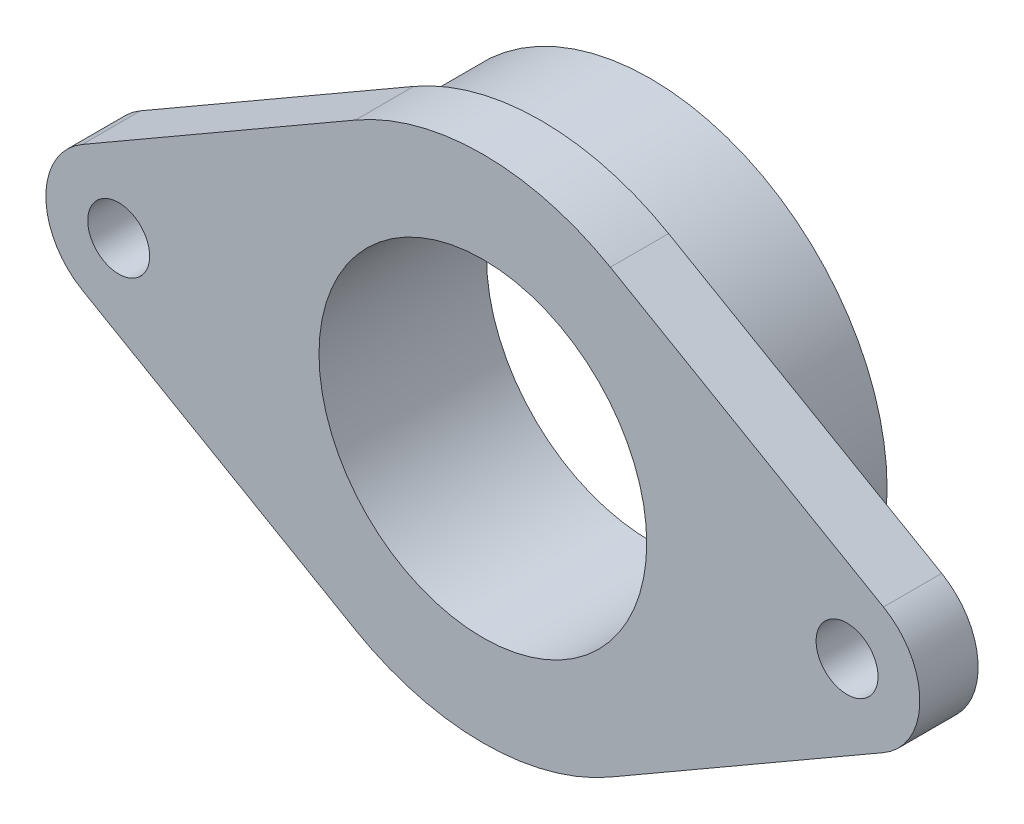
ISO-10303-21;
HEADER;
FILE_DESCRIPTION(('STEP AP214'),'2;1');
FILE_NAME('part.step','',(''),(''),'','','');
FILE_SCHEMA(('AUTOMOTIVE_DESIGN { 1 0 10303 214 1 1 1 1 }'));
ENDSEC;
DATA;
#1=APPLICATION_CONTEXT('core data for automotive mechanical design processes');
#2=APPLICATION_PROTOCOL_DEFINITION('international standard','automotive_design',2000,#1);
#3=PRODUCT_CONTEXT('',#1,'mechanical');
#4=PRODUCT('Part','Part','',(#3));
#5=PRODUCT_RELATED_PRODUCT_CATEGORY('part','',(#4));
#6=PRODUCT_DEFINITION_FORMATION('','',#4);
#7=PRODUCT_DEFINITION_CONTEXT('part definition',#1,'design');
#8=PRODUCT_DEFINITION('design','',#6,#7);
#9=PRODUCT_DEFINITION_SHAPE('','',#8);
#10=(LENGTH_UNIT() NAMED_UNIT(*) SI_UNIT(.MILLI.,.METRE.));
#11=(NAMED_UNIT(*) PLANE_ANGLE_UNIT() SI_UNIT($,.RADIAN.));
#12=(NAMED_UNIT(*) SI_UNIT($,.STERADIAN.) SOLID_ANGLE_UNIT());
#13=UNCERTAINTY_MEASURE_WITH_UNIT(LENGTH_MEASURE(1.E-05),#10,'distance_accuracy_value','');
#14=(GEOMETRIC_REPRESENTATION_CONTEXT(3) GLOBAL_UNCERTAINTY_ASSIGNED_CONTEXT((#13)) GLOBAL_UNIT_ASSIGNED_CONTEXT((#10,
#11,#12)) REPRESENTATION_CONTEXT('',''));
#15=CARTESIAN_POINT('',(0.,0.,0.));
#16=DIRECTION('',(0.,0.,1.));
#17=DIRECTION('',(1.,0.,0.));
#18=AXIS2_PLACEMENT_3D('',#15,#16,#17);
#19=CARTESIAN_POINT('',(-50.,0.,0.));
#20=DIRECTION('',(0.,0.,1.));
#21=DIRECTION('',(1.,0.,0.));
#22=AXIS2_PLACEMENT_3D('',#19,#20,#21);
#23=PLANE('',#22);
#24=CARTESIAN_POINT('',(-50.,0.,0.));
#25=DIRECTION('',(0.,0.,1.));
#26=DIRECTION('',(1.,0.,0.));
#27=AXIS2_PLACEMENT_3D('',#24,#25,#26);
#28=CIRCLE('',#27,4.25000000000001);
#29=CARTESIAN_POINT('',(-45.75,0.,0.));
#30=VERTEX_POINT('',#29);
#31=EDGE_CURVE('E227',#30,#30,#28,.T.);
#32=ORIENTED_EDGE('',*,*,#31,.T.);
#33=EDGE_LOOP('',(#32));
#34=FACE_BOUND('',#33,.T.);
#35=CARTESIAN_POINT('',(50.,0.,0.));
#36=DIRECTION('',(0.,0.,1.));
#37=DIRECTION('',(1.,0.,0.));
#38=AXIS2_PLACEMENT_3D('',#35,#36,#37);
#39=CIRCLE('',#38,4.25000000000001);
#40=CARTESIAN_POINT('',(54.25,0.,0.));
#41=VERTEX_POINT('',#40);
#42=EDGE_CURVE('E219',#41,#41,#39,.T.);
#43=ORIENTED_EDGE('',*,*,#42,.T.);
#44=EDGE_LOOP('',(#43));
#45=FACE_BOUND('',#44,.T.);
#46=CARTESIAN_POINT('',(-50.,0.,0.));
#47=DIRECTION('',(0.,0.,1.));
#48=DIRECTION('',(1.,0.,0.));
#49=AXIS2_PLACEMENT_3D('',#46,#47,#48);
#50=CIRCLE('',#49,10.);
#51=CARTESIAN_POINT('',(-55.,8.66025403784439,0.));
#52=VERTEX_POINT('',#51);
#53=CARTESIAN_POINT('',(-55.,-8.66025403784439,0.));
#54=VERTEX_POINT('',#53);
#55=EDGE_CURVE('E143',#52,#54,#50,.T.);
#56=ORIENTED_EDGE('',*,*,#55,.F.);
#57=DIRECTION('',(-0.866025403784438,-0.5,0.));
#58=VECTOR('',#57,1.);
#59=CARTESIAN_POINT('',(-55.,8.66025403784439,0.));
#60=LINE('',#59,#58);
#61=CARTESIAN_POINT('',(-17.5,30.3108891324554,0.));
#62=VERTEX_POINT('',#61);
#63=EDGE_CURVE('E92',#62,#52,#60,.T.);
#64=ORIENTED_EDGE('',*,*,#63,.F.);
#65=CARTESIAN_POINT('',(0.,0.,0.));
#66=DIRECTION('',(0.,0.,1.));
#67=DIRECTION('',(1.,0.,0.));
#68=AXIS2_PLACEMENT_3D('',#65,#66,#67);
#69=CIRCLE('',#68,35.);
#70=CARTESIAN_POINT('',(17.5,30.3108891324554,0.));
#71=VERTEX_POINT('',#70);
#72=EDGE_CURVE('E86',#71,#62,#69,.T.);
#73=ORIENTED_EDGE('',*,*,#72,.F.);
#74=DIRECTION('',(-0.866025403784438,0.5,0.));
#75=VECTOR('',#74,1.);
#76=CARTESIAN_POINT('',(55.,8.66025403784439,0.));
#77=LINE('',#76,#75);
#78=CARTESIAN_POINT('',(55.,8.66025403784439,0.));
#79=VERTEX_POINT('',#78);
#80=EDGE_CURVE('E130',#79,#71,#77,.T.);
#81=ORIENTED_EDGE('',*,*,#80,.F.);
#82=CARTESIAN_POINT('',(50.,0.,0.));
#83=DIRECTION('',(0.,0.,1.));
#84=DIRECTION('',(1.,0.,0.));
#85=AXIS2_PLACEMENT_3D('',#82,#83,#84);
#86=CIRCLE('',#85,10.);
#87=CARTESIAN_POINT('',(55.,-8.66025403784439,0.));
#88=VERTEX_POINT('',#87);
#89=EDGE_CURVE('E157',#88,#79,#86,.T.);
#90=ORIENTED_EDGE('',*,*,#89,.F.);
#91=DIRECTION('',(0.866025403784438,0.5,0.));
#92=VECTOR('',#91,1.);
#93=CARTESIAN_POINT('',(55.,-8.66025403784439,0.));
#94=LINE('',#93,#92);
#95=CARTESIAN_POINT('',(17.5,-30.3108891324554,0.));
#96=VERTEX_POINT('',#95);
#97=EDGE_CURVE('E154',#96,#88,#94,.T.);
#98=ORIENTED_EDGE('',*,*,#97,.F.);
#99=CARTESIAN_POINT('',(0.,0.,0.));
#100=DIRECTION('',(0.,0.,1.));
#101=DIRECTION('',(1.,0.,0.));
#102=AXIS2_PLACEMENT_3D('',#99,#100,#101);
#103=CIRCLE('',#102,35.);
#104=CARTESIAN_POINT('',(-17.5,-30.3108891324554,0.));
#105=VERTEX_POINT('',#104);
#106=EDGE_CURVE('E151',#105,#96,#103,.T.);
#107=ORIENTED_EDGE('',*,*,#106,.F.);
#108=DIRECTION('',(0.866025403784438,-0.5,0.));
#109=VECTOR('',#108,1.);
#110=CARTESIAN_POINT('',(-55.,-8.66025403784439,0.));
#111=LINE('',#110,#109);
#112=EDGE_CURVE('E147',#54,#105,#111,.T.);
#113=ORIENTED_EDGE('',*,*,#112,.F.);
#114=EDGE_LOOP('',(#56,#64,#73,#81,#90,#98,#107,#113));
#115=FACE_BOUND('',#114,.T.);
#116=CARTESIAN_POINT('',(0.,0.,0.));
#117=DIRECTION('',(0.,0.,1.));
#118=DIRECTION('',(1.,0.,0.));
#119=AXIS2_PLACEMENT_3D('',#116,#117,#118);
#120=CIRCLE('',#119,32.5);
#121=CARTESIAN_POINT('',(32.5,0.,0.));
#122=VERTEX_POINT('',#121);
#123=EDGE_CURVE('E11',#122,#122,#120,.F.);
#124=ORIENTED_EDGE('',*,*,#123,.F.);
#125=EDGE_LOOP('',(#124));
#126=FACE_BOUND('',#125,.T.);
#127=ADVANCED_FACE('F39',(#34,#45,#115,#126),#23,.F.);
#128=CARTESIAN_POINT('',(-50.,0.,8.));
#129=DIRECTION('',(0.,0.,1.));
#130=DIRECTION('',(1.,0.,0.));
#131=AXIS2_PLACEMENT_3D('',#128,#129,#130);
#132=PLANE('',#131);
#133=CARTESIAN_POINT('',(50.,0.,8.));
#134=DIRECTION('',(0.,0.,1.));
#135=DIRECTION('',(1.,0.,0.));
#136=AXIS2_PLACEMENT_3D('',#133,#134,#135);
#137=CIRCLE('',#136,4.25000000000001);
#138=CARTESIAN_POINT('',(54.25,0.,8.));
#139=VERTEX_POINT('',#138);
#140=EDGE_CURVE('E218',#139,#139,#137,.T.);
#141=ORIENTED_EDGE('',*,*,#140,.F.);
#142=EDGE_LOOP('',(#141));
#143=FACE_BOUND('',#142,.T.);
#144=CARTESIAN_POINT('',(-50.,0.,8.));
#145=DIRECTION('',(0.,0.,1.));
#146=DIRECTION('',(1.,0.,0.));
#147=AXIS2_PLACEMENT_3D('',#144,#145,#146);
#148=CIRCLE('',#147,10.);
#149=CARTESIAN_POINT('',(-55.,8.66025403784439,8.));
#150=VERTEX_POINT('',#149);
#151=CARTESIAN_POINT('',(-55.,-8.66025403784439,8.));
#152=VERTEX_POINT('',#151);
#153=EDGE_CURVE('E166',#150,#152,#148,.T.);
#154=ORIENTED_EDGE('',*,*,#153,.T.);
#155=DIRECTION('',(0.866025403784438,-0.5,0.));
#156=VECTOR('',#155,1.);
#157=CARTESIAN_POINT('',(-55.,-8.66025403784439,8.));
#158=LINE('',#157,#156);
#159=CARTESIAN_POINT('',(-17.5,-30.3108891324554,8.));
#160=VERTEX_POINT('',#159);
#161=EDGE_CURVE('E101',#152,#160,#158,.T.);
#162=ORIENTED_EDGE('',*,*,#161,.T.);
#163=CARTESIAN_POINT('',(0.,0.,8.));
#164=DIRECTION('',(0.,0.,1.));
#165=DIRECTION('',(1.,0.,0.));
#166=AXIS2_PLACEMENT_3D('',#163,#164,#165);
#167=CIRCLE('',#166,35.);
#168=CARTESIAN_POINT('',(17.5,-30.3108891324554,8.));
#169=VERTEX_POINT('',#168);
#170=EDGE_CURVE('E205',#160,#169,#167,.T.);
#171=ORIENTED_EDGE('',*,*,#170,.T.);
#172=DIRECTION('',(0.866025403784438,0.5,0.));
#173=VECTOR('',#172,1.);
#174=CARTESIAN_POINT('',(55.,-8.66025403784439,8.));
#175=LINE('',#174,#173);
#176=CARTESIAN_POINT('',(55.,-8.66025403784439,8.));
#177=VERTEX_POINT('',#176);
#178=EDGE_CURVE('E203',#169,#177,#175,.T.);
#179=ORIENTED_EDGE('',*,*,#178,.T.);
#180=CARTESIAN_POINT('',(50.,0.,8.));
#181=DIRECTION('',(0.,0.,1.));
#182=DIRECTION('',(1.,0.,0.));
#183=AXIS2_PLACEMENT_3D('',#180,#181,#182);
#184=CIRCLE('',#183,10.);
#185=CARTESIAN_POINT('',(55.,8.66025403784439,8.));
#186=VERTEX_POINT('',#185);
#187=EDGE_CURVE('E121',#177,#186,#184,.T.);
#188=ORIENTED_EDGE('',*,*,#187,.T.);
#189=DIRECTION('',(-0.866025403784438,0.5,0.));
#190=VECTOR('',#189,1.);
#191=CARTESIAN_POINT('',(55.,8.66025403784439,8.));
#192=LINE('',#191,#190);
#193=CARTESIAN_POINT('',(17.5,30.3108891324554,8.));
#194=VERTEX_POINT('',#193);
#195=EDGE_CURVE('E114',#186,#194,#192,.T.);
#196=ORIENTED_EDGE('',*,*,#195,.T.);
#197=CARTESIAN_POINT('',(0.,0.,8.));
#198=DIRECTION('',(0.,0.,1.));
#199=DIRECTION('',(1.,0.,0.));
#200=AXIS2_PLACEMENT_3D('',#197,#198,#199);
#201=CIRCLE('',#200,35.);
#202=CARTESIAN_POINT('',(-17.5,30.3108891324554,8.));
#203=VERTEX_POINT('',#202);
#204=EDGE_CURVE('E119',#194,#203,#201,.T.);
#205=ORIENTED_EDGE('',*,*,#204,.T.);
#206=DIRECTION('',(-0.866025403784438,-0.5,0.));
#207=VECTOR('',#206,1.);
#208=CARTESIAN_POINT('',(-55.,8.66025403784439,8.));
#209=LINE('',#208,#207);
#210=EDGE_CURVE('E57',#203,#150,#209,.T.);
#211=ORIENTED_EDGE('',*,*,#210,.T.);
#212=EDGE_LOOP('',(#154,#162,#171,#179,#188,#196,#205,#211));
#213=FACE_BOUND('',#212,.T.);
#214=CARTESIAN_POINT('',(0.,0.,8.));
#215=DIRECTION('',(0.,0.,1.));
#216=DIRECTION('',(1.,0.,0.));
#217=AXIS2_PLACEMENT_3D('',#214,#215,#216);
#218=CIRCLE('',#217,22.5);
#219=CARTESIAN_POINT('',(22.5,0.,8.));
#220=VERTEX_POINT('',#219);
#221=EDGE_CURVE('E148',#220,#220,#218,.T.);
#222=ORIENTED_EDGE('',*,*,#221,.F.);
#223=EDGE_LOOP('',(#222));
#224=FACE_BOUND('',#223,.T.);
#225=CARTESIAN_POINT('',(-50.,0.,8.));
#226=DIRECTION('',(0.,0.,1.));
#227=DIRECTION('',(1.,0.,0.));
#228=AXIS2_PLACEMENT_3D('',#225,#226,#227);
#229=CIRCLE('',#228,4.25000000000001);
#230=CARTESIAN_POINT('',(-45.75,0.,8.));
#231=VERTEX_POINT('',#230);
#232=EDGE_CURVE('E223',#231,#231,#229,.T.);
#233=ORIENTED_EDGE('',*,*,#232,.F.);
#234=EDGE_LOOP('',(#233));
#235=FACE_BOUND('',#234,.T.);
#236=ADVANCED_FACE('F116',(#143,#213,#224,#235),#132,.T.);
#237=CARTESIAN_POINT('',(-50.,0.,8.));
#238=DIRECTION('',(0.,0.,-1.));
#239=DIRECTION('',(-1.,0.,0.));
#240=AXIS2_PLACEMENT_3D('',#237,#238,#239);
#241=CYLINDRICAL_SURFACE('',#240,10.);
#242=ORIENTED_EDGE('',*,*,#55,.T.);
#243=DIRECTION('',(0.,0.,-1.));
#244=VECTOR('',#243,1.);
#245=CARTESIAN_POINT('',(-55.,-8.66025403784439,8.));
#246=LINE('',#245,#244);
#247=EDGE_CURVE('E49',#152,#54,#246,.T.);
#248=ORIENTED_EDGE('',*,*,#247,.F.);
#249=ORIENTED_EDGE('',*,*,#153,.F.);
#250=DIRECTION('',(0.,0.,-1.));
#251=VECTOR('',#250,1.);
#252=CARTESIAN_POINT('',(-55.,8.66025403784439,8.));
#253=LINE('',#252,#251);
#254=EDGE_CURVE('E139',#150,#52,#253,.T.);
#255=ORIENTED_EDGE('',*,*,#254,.T.);
#256=EDGE_LOOP('',(#242,#248,#249,#255));
#257=FACE_BOUND('',#256,.T.);
#258=ADVANCED_FACE('F41',(#257),#241,.T.);
#259=CARTESIAN_POINT('',(-55.,-8.66025403784439,8.));
#260=DIRECTION('',(0.5,0.866025403784439,0.));
#261=DIRECTION('',(-0.866025403784438,0.5,0.));
#262=AXIS2_PLACEMENT_3D('',#259,#260,#261);
#263=PLANE('',#262);
#264=ORIENTED_EDGE('',*,*,#112,.T.);
#265=DIRECTION('',(0.,0.,-1.));
#266=VECTOR('',#265,1.);
#267=CARTESIAN_POINT('',(-17.5,-30.3108891324554,8.));
#268=LINE('',#267,#266);
#269=EDGE_CURVE('E181',#160,#105,#268,.T.);
#270=ORIENTED_EDGE('',*,*,#269,.F.);
#271=ORIENTED_EDGE('',*,*,#161,.F.);
#272=ORIENTED_EDGE('',*,*,#247,.T.);
#273=EDGE_LOOP('',(#264,#270,#271,#272));
#274=FACE_BOUND('',#273,.T.);
#275=ADVANCED_FACE('F186',(#274),#263,.F.);
#276=CARTESIAN_POINT('',(0.,0.,8.));
#277=DIRECTION('',(0.,0.,-1.));
#278=DIRECTION('',(-1.,0.,0.));
#279=AXIS2_PLACEMENT_3D('',#276,#277,#278);
#280=CYLINDRICAL_SURFACE('',#279,35.);
#281=ORIENTED_EDGE('',*,*,#106,.T.);
#282=DIRECTION('',(0.,0.,-1.));
#283=VECTOR('',#282,1.);
#284=CARTESIAN_POINT('',(17.5,-30.3108891324554,8.));
#285=LINE('',#284,#283);
#286=EDGE_CURVE('E177',#169,#96,#285,.T.);
#287=ORIENTED_EDGE('',*,*,#286,.F.);
#288=ORIENTED_EDGE('',*,*,#170,.F.);
#289=ORIENTED_EDGE('',*,*,#269,.T.);
#290=EDGE_LOOP('',(#281,#287,#288,#289));
#291=FACE_BOUND('',#290,.T.);
#292=ADVANCED_FACE('F197',(#291),#280,.T.);
#293=CARTESIAN_POINT('',(55.,-8.66025403784439,8.));
#294=DIRECTION('',(-0.5,0.866025403784439,0.));
#295=DIRECTION('',(-0.866025403784438,-0.5,0.));
#296=AXIS2_PLACEMENT_3D('',#293,#294,#295);
#297=PLANE('',#296);
#298=ORIENTED_EDGE('',*,*,#97,.T.);
#299=DIRECTION('',(0.,0.,-1.));
#300=VECTOR('',#299,1.);
#301=CARTESIAN_POINT('',(55.,-8.66025403784439,8.));
#302=LINE('',#301,#300);
#303=EDGE_CURVE('E173',#177,#88,#302,.T.);
#304=ORIENTED_EDGE('',*,*,#303,.F.);
#305=ORIENTED_EDGE('',*,*,#178,.F.);
#306=ORIENTED_EDGE('',*,*,#286,.T.);
#307=EDGE_LOOP('',(#298,#304,#305,#306));
#308=FACE_BOUND('',#307,.T.);
#309=ADVANCED_FACE('F201',(#308),#297,.F.);
#310=CARTESIAN_POINT('',(50.,0.,8.));
#311=DIRECTION('',(0.,0.,-1.));
#312=DIRECTION('',(-1.,0.,0.));
#313=AXIS2_PLACEMENT_3D('',#310,#311,#312);
#314=CYLINDRICAL_SURFACE('',#313,10.);
#315=ORIENTED_EDGE('',*,*,#89,.T.);
#316=DIRECTION('',(0.,0.,-1.));
#317=VECTOR('',#316,1.);
#318=CARTESIAN_POINT('',(55.,8.66025403784439,8.));
#319=LINE('',#318,#317);
#320=EDGE_CURVE('E132',#186,#79,#319,.T.);
#321=ORIENTED_EDGE('',*,*,#320,.F.);
#322=ORIENTED_EDGE('',*,*,#187,.F.);
#323=ORIENTED_EDGE('',*,*,#303,.T.);
#324=EDGE_LOOP('',(#315,#321,#322,#323));
#325=FACE_BOUND('',#324,.T.);
#326=ADVANCED_FACE('F278',(#325),#314,.T.);
#327=CARTESIAN_POINT('',(55.,8.66025403784439,8.));
#328=DIRECTION('',(-0.5,-0.866025403784439,0.));
#329=DIRECTION('',(0.866025403784438,-0.5,0.));
#330=AXIS2_PLACEMENT_3D('',#327,#328,#329);
#331=PLANE('',#330);
#332=ORIENTED_EDGE('',*,*,#80,.T.);
#333=DIRECTION('',(0.,0.,-1.));
#334=VECTOR('',#333,1.);
#335=CARTESIAN_POINT('',(17.5,30.3108891324554,8.));
#336=LINE('',#335,#334);
#337=EDGE_CURVE('E127',#194,#71,#336,.T.);
#338=ORIENTED_EDGE('',*,*,#337,.F.);
#339=ORIENTED_EDGE('',*,*,#195,.F.);
#340=ORIENTED_EDGE('',*,*,#320,.T.);
#341=EDGE_LOOP('',(#332,#338,#339,#340));
#342=FACE_BOUND('',#341,.T.);
#343=ADVANCED_FACE('F128',(#342),#331,.F.);
#344=CARTESIAN_POINT('',(0.,0.,8.));
#345=DIRECTION('',(0.,0.,-1.));
#346=DIRECTION('',(-1.,0.,0.));
#347=AXIS2_PLACEMENT_3D('',#344,#345,#346);
#348=CYLINDRICAL_SURFACE('',#347,35.);
#349=ORIENTED_EDGE('',*,*,#72,.T.);
#350=DIRECTION('',(0.,0.,-1.));
#351=VECTOR('',#350,1.);
#352=CARTESIAN_POINT('',(-17.5,30.3108891324554,8.));
#353=LINE('',#352,#351);
#354=EDGE_CURVE('E133',#203,#62,#353,.T.);
#355=ORIENTED_EDGE('',*,*,#354,.F.);
#356=ORIENTED_EDGE('',*,*,#204,.F.);
#357=ORIENTED_EDGE('',*,*,#337,.T.);
#358=EDGE_LOOP('',(#349,#355,#356,#357));
#359=FACE_BOUND('',#358,.T.);
#360=ADVANCED_FACE('F135',(#359),#348,.T.);
#361=CARTESIAN_POINT('',(-55.,8.66025403784439,8.));
#362=DIRECTION('',(0.5,-0.866025403784439,0.));
#363=DIRECTION('',(0.866025403784438,0.5,0.));
#364=AXIS2_PLACEMENT_3D('',#361,#362,#363);
#365=PLANE('',#364);
#366=ORIENTED_EDGE('',*,*,#63,.T.);
#367=ORIENTED_EDGE('',*,*,#254,.F.);
#368=ORIENTED_EDGE('',*,*,#210,.F.);
#369=ORIENTED_EDGE('',*,*,#354,.T.);
#370=EDGE_LOOP('',(#366,#367,#368,#369));
#371=FACE_BOUND('',#370,.T.);
#372=ADVANCED_FACE('F271',(#371),#365,.F.);
#373=CARTESIAN_POINT('',(0.,0.,8.));
#374=DIRECTION('',(0.,0.,-1.));
#375=DIRECTION('',(-1.,0.,0.));
#376=AXIS2_PLACEMENT_3D('',#373,#374,#375);
#377=CYLINDRICAL_SURFACE('',#376,22.5);
#378=ORIENTED_EDGE('',*,*,#221,.T.);
#379=EDGE_LOOP('',(#378));
#380=FACE_BOUND('',#379,.T.);
#381=CARTESIAN_POINT('',(0.,0.,-15.));
#382=DIRECTION('',(0.,0.,-1.));
#383=DIRECTION('',(-1.,0.,0.));
#384=AXIS2_PLACEMENT_3D('',#381,#382,#383);
#385=CIRCLE('',#384,22.5);
#386=CARTESIAN_POINT('',(-22.5,0.,-15.));
#387=VERTEX_POINT('',#386);
#388=EDGE_CURVE('E238',#387,#387,#385,.T.);
#389=ORIENTED_EDGE('',*,*,#388,.T.);
#390=EDGE_LOOP('',(#389));
#391=FACE_BOUND('',#390,.T.);
#392=ADVANCED_FACE('F243',(#380,#391),#377,.F.);
#393=CARTESIAN_POINT('',(50.,0.,8.));
#394=DIRECTION('',(0.,0.,-1.));
#395=DIRECTION('',(-1.,0.,0.));
#396=AXIS2_PLACEMENT_3D('',#393,#394,#395);
#397=CYLINDRICAL_SURFACE('',#396,4.25000000000001);
#398=ORIENTED_EDGE('',*,*,#140,.T.);
#399=EDGE_LOOP('',(#398));
#400=FACE_BOUND('',#399,.T.);
#401=ORIENTED_EDGE('',*,*,#42,.F.);
#402=EDGE_LOOP('',(#401));
#403=FACE_BOUND('',#402,.T.);
#404=ADVANCED_FACE('F257',(#400,#403),#397,.F.);
#405=CARTESIAN_POINT('',(-50.,0.,8.));
#406=DIRECTION('',(0.,0.,-1.));
#407=DIRECTION('',(-1.,0.,0.));
#408=AXIS2_PLACEMENT_3D('',#405,#406,#407);
#409=CYLINDRICAL_SURFACE('',#408,4.25000000000001);
#410=ORIENTED_EDGE('',*,*,#232,.T.);
#411=EDGE_LOOP('',(#410));
#412=FACE_BOUND('',#411,.T.);
#413=ORIENTED_EDGE('',*,*,#31,.F.);
#414=EDGE_LOOP('',(#413));
#415=FACE_BOUND('',#414,.T.);
#416=ADVANCED_FACE('F248',(#412,#415),#409,.F.);
#417=CARTESIAN_POINT('',(0.,0.,-15.));
#418=DIRECTION('',(0.,0.,-1.));
#419=DIRECTION('',(-1.,0.,0.));
#420=AXIS2_PLACEMENT_3D('',#417,#418,#419);
#421=PLANE('',#420);
#422=CARTESIAN_POINT('',(0.,0.,-15.));
#423=DIRECTION('',(0.,0.,-1.));
#424=DIRECTION('',(-1.,0.,0.));
#425=AXIS2_PLACEMENT_3D('',#422,#423,#424);
#426=CIRCLE('',#425,32.5);
#427=CARTESIAN_POINT('',(-32.5,0.,-15.));
#428=VERTEX_POINT('',#427);
#429=EDGE_CURVE('E231',#428,#428,#426,.T.);
#430=ORIENTED_EDGE('',*,*,#429,.T.);
#431=EDGE_LOOP('',(#430));
#432=FACE_BOUND('',#431,.T.);
#433=ORIENTED_EDGE('',*,*,#388,.F.);
#434=EDGE_LOOP('',(#433));
#435=FACE_BOUND('',#434,.T.);
#436=ADVANCED_FACE('F245',(#432,#435),#421,.T.);
#437=CARTESIAN_POINT('',(0.,0.,-15.));
#438=DIRECTION('',(0.,0.,1.));
#439=DIRECTION('',(1.,0.,0.));
#440=AXIS2_PLACEMENT_3D('',#437,#438,#439);
#441=CYLINDRICAL_SURFACE('',#440,32.5);
#442=ORIENTED_EDGE('',*,*,#429,.F.);
#443=EDGE_LOOP('',(#442));
#444=FACE_BOUND('',#443,.T.);
#445=ORIENTED_EDGE('',*,*,#123,.T.);
#446=EDGE_LOOP('',(#445));
#447=FACE_BOUND('',#446,.T.);
#448=ADVANCED_FACE('F247',(#444,#447),#441,.T.);
#449=CLOSED_SHELL('',(#127,#236,#258,#275,#292,#309,#326,#343,#360,#372,#392,#404,#416,#436,#448));
#450=MANIFOLD_SOLID_BREP('B2',#449);
#451=ADVANCED_BREP_SHAPE_REPRESENTATION('',(#18,#450),#14);
#452=SHAPE_DEFINITION_REPRESENTATION(#9,#451);
ENDSEC;
END-ISO-10303-21;
